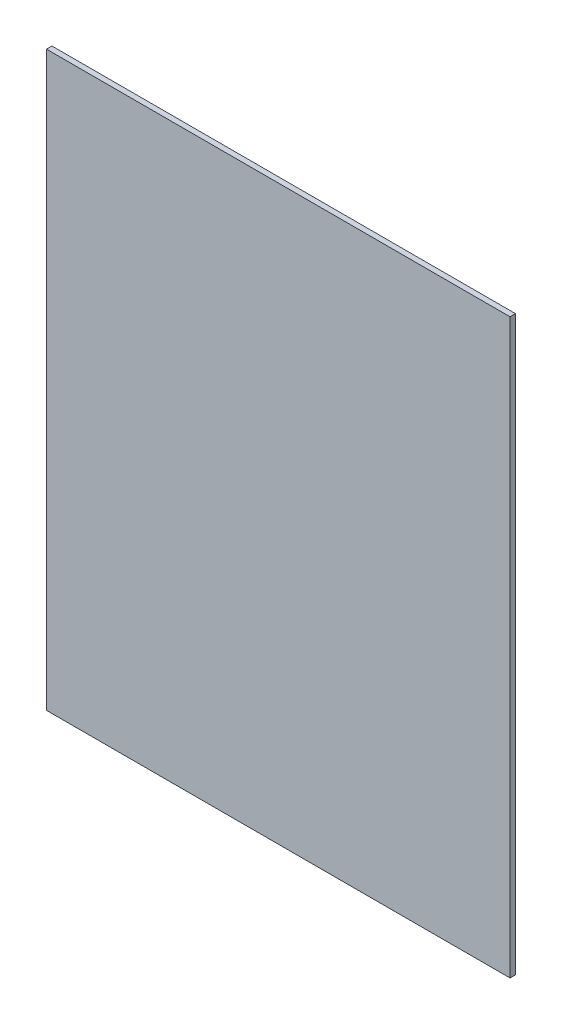
ISO-10303-21;
HEADER;
FILE_DESCRIPTION(('STEP AP214'),'2;1');
FILE_NAME('part.step','',(''),(''),'','','');
FILE_SCHEMA(('AUTOMOTIVE_DESIGN { 1 0 10303 214 1 1 1 1 }'));
ENDSEC;
DATA;
#1=APPLICATION_CONTEXT('core data for automotive mechanical design processes');
#2=APPLICATION_PROTOCOL_DEFINITION('international standard','automotive_design',2000,#1);
#3=PRODUCT_CONTEXT('',#1,'mechanical');
#4=PRODUCT('Part','Part','',(#3));
#5=PRODUCT_RELATED_PRODUCT_CATEGORY('part','',(#4));
#6=PRODUCT_DEFINITION_FORMATION('','',#4);
#7=PRODUCT_DEFINITION_CONTEXT('part definition',#1,'design');
#8=PRODUCT_DEFINITION('design','',#6,#7);
#9=PRODUCT_DEFINITION_SHAPE('','',#8);
#10=(LENGTH_UNIT() NAMED_UNIT(*) SI_UNIT(.MILLI.,.METRE.));
#11=(NAMED_UNIT(*) PLANE_ANGLE_UNIT() SI_UNIT($,.RADIAN.));
#12=(NAMED_UNIT(*) SI_UNIT($,.STERADIAN.) SOLID_ANGLE_UNIT());
#13=UNCERTAINTY_MEASURE_WITH_UNIT(LENGTH_MEASURE(1.E-05),#10,'distance_accuracy_value','');
#14=(GEOMETRIC_REPRESENTATION_CONTEXT(3) GLOBAL_UNCERTAINTY_ASSIGNED_CONTEXT((#13)) GLOBAL_UNIT_ASSIGNED_CONTEXT((#10,
#11,#12)) REPRESENTATION_CONTEXT('',''));
#15=CARTESIAN_POINT('',(0.,0.,0.));
#16=DIRECTION('',(0.,0.,1.));
#17=DIRECTION('',(1.,0.,0.));
#18=AXIS2_PLACEMENT_3D('',#15,#16,#17);
#19=CARTESIAN_POINT('',(-85.,-105.,2.));
#20=DIRECTION('',(1.,0.,0.));
#21=DIRECTION('',(0.,0.,-1.));
#22=AXIS2_PLACEMENT_3D('',#19,#20,#21);
#23=PLANE('',#22);
#24=DIRECTION('',(0.,-1.,0.));
#25=VECTOR('',#24,1.);
#26=CARTESIAN_POINT('',(-85.,-105.,0.));
#27=LINE('',#26,#25);
#28=CARTESIAN_POINT('',(-85.,105.,0.));
#29=VERTEX_POINT('',#28);
#30=CARTESIAN_POINT('',(-85.,-105.,0.));
#31=VERTEX_POINT('',#30);
#32=EDGE_CURVE('E98',#29,#31,#27,.T.);
#33=ORIENTED_EDGE('',*,*,#32,.T.);
#34=DIRECTION('',(0.,0.,-1.));
#35=VECTOR('',#34,1.);
#36=CARTESIAN_POINT('',(-85.,-105.,2.));
#37=LINE('',#36,#35);
#38=CARTESIAN_POINT('',(-85.,-105.,2.));
#39=VERTEX_POINT('',#38);
#40=EDGE_CURVE('E11',#39,#31,#37,.T.);
#41=ORIENTED_EDGE('',*,*,#40,.F.);
#42=DIRECTION('',(0.,-1.,0.));
#43=VECTOR('',#42,1.);
#44=CARTESIAN_POINT('',(-85.,-105.,2.));
#45=LINE('',#44,#43);
#46=CARTESIAN_POINT('',(-85.,105.,2.));
#47=VERTEX_POINT('',#46);
#48=EDGE_CURVE('E86',#47,#39,#45,.T.);
#49=ORIENTED_EDGE('',*,*,#48,.F.);
#50=DIRECTION('',(0.,0.,-1.));
#51=VECTOR('',#50,1.);
#52=CARTESIAN_POINT('',(-85.,105.,2.));
#53=LINE('',#52,#51);
#54=EDGE_CURVE('E94',#47,#29,#53,.T.);
#55=ORIENTED_EDGE('',*,*,#54,.T.);
#56=EDGE_LOOP('',(#33,#41,#49,#55));
#57=FACE_BOUND('',#56,.T.);
#58=ADVANCED_FACE('F35',(#57),#23,.F.);
#59=CARTESIAN_POINT('',(85.,-105.,2.));
#60=DIRECTION('',(0.,1.,0.));
#61=DIRECTION('',(-1.,0.,0.));
#62=AXIS2_PLACEMENT_3D('',#59,#60,#61);
#63=PLANE('',#62);
#64=DIRECTION('',(1.,0.,0.));
#65=VECTOR('',#64,1.);
#66=CARTESIAN_POINT('',(85.,-105.,0.));
#67=LINE('',#66,#65);
#68=CARTESIAN_POINT('',(85.,-105.,0.));
#69=VERTEX_POINT('',#68);
#70=EDGE_CURVE('E90',#31,#69,#67,.T.);
#71=ORIENTED_EDGE('',*,*,#70,.T.);
#72=DIRECTION('',(0.,0.,-1.));
#73=VECTOR('',#72,1.);
#74=CARTESIAN_POINT('',(85.,-105.,2.));
#75=LINE('',#74,#73);
#76=CARTESIAN_POINT('',(85.,-105.,2.));
#77=VERTEX_POINT('',#76);
#78=EDGE_CURVE('E43',#77,#69,#75,.T.);
#79=ORIENTED_EDGE('',*,*,#78,.F.);
#80=DIRECTION('',(1.,0.,0.));
#81=VECTOR('',#80,1.);
#82=CARTESIAN_POINT('',(85.,-105.,2.));
#83=LINE('',#82,#81);
#84=EDGE_CURVE('E81',#39,#77,#83,.T.);
#85=ORIENTED_EDGE('',*,*,#84,.F.);
#86=ORIENTED_EDGE('',*,*,#40,.T.);
#87=EDGE_LOOP('',(#71,#79,#85,#86));
#88=FACE_BOUND('',#87,.T.);
#89=ADVANCED_FACE('F89',(#88),#63,.F.);
#90=CARTESIAN_POINT('',(85.,-105.,2.));
#91=DIRECTION('',(-1.,0.,0.));
#92=DIRECTION('',(0.,0.,1.));
#93=AXIS2_PLACEMENT_3D('',#90,#91,#92);
#94=PLANE('',#93);
#95=DIRECTION('',(0.,1.,0.));
#96=VECTOR('',#95,1.);
#97=CARTESIAN_POINT('',(85.,-105.,0.));
#98=LINE('',#97,#96);
#99=CARTESIAN_POINT('',(85.,105.,0.));
#100=VERTEX_POINT('',#99);
#101=EDGE_CURVE('E68',#69,#100,#98,.T.);
#102=ORIENTED_EDGE('',*,*,#101,.T.);
#103=DIRECTION('',(0.,0.,-1.));
#104=VECTOR('',#103,1.);
#105=CARTESIAN_POINT('',(85.,105.,2.));
#106=LINE('',#105,#104);
#107=CARTESIAN_POINT('',(85.,105.,2.));
#108=VERTEX_POINT('',#107);
#109=EDGE_CURVE('E91',#108,#100,#106,.T.);
#110=ORIENTED_EDGE('',*,*,#109,.F.);
#111=DIRECTION('',(0.,1.,0.));
#112=VECTOR('',#111,1.);
#113=CARTESIAN_POINT('',(85.,-105.,2.));
#114=LINE('',#113,#112);
#115=EDGE_CURVE('E84',#77,#108,#114,.T.);
#116=ORIENTED_EDGE('',*,*,#115,.F.);
#117=ORIENTED_EDGE('',*,*,#78,.T.);
#118=EDGE_LOOP('',(#102,#110,#116,#117));
#119=FACE_BOUND('',#118,.T.);
#120=ADVANCED_FACE('F92',(#119),#94,.F.);
#121=CARTESIAN_POINT('',(85.,105.,2.));
#122=DIRECTION('',(0.,-1.,0.));
#123=DIRECTION('',(1.,0.,0.));
#124=AXIS2_PLACEMENT_3D('',#121,#122,#123);
#125=PLANE('',#124);
#126=DIRECTION('',(-1.,0.,0.));
#127=VECTOR('',#126,1.);
#128=CARTESIAN_POINT('',(85.,105.,0.));
#129=LINE('',#128,#127);
#130=EDGE_CURVE('E74',#100,#29,#129,.T.);
#131=ORIENTED_EDGE('',*,*,#130,.T.);
#132=ORIENTED_EDGE('',*,*,#54,.F.);
#133=DIRECTION('',(-1.,0.,0.));
#134=VECTOR('',#133,1.);
#135=CARTESIAN_POINT('',(85.,105.,2.));
#136=LINE('',#135,#134);
#137=EDGE_CURVE('E51',#108,#47,#136,.T.);
#138=ORIENTED_EDGE('',*,*,#137,.F.);
#139=ORIENTED_EDGE('',*,*,#109,.T.);
#140=EDGE_LOOP('',(#131,#132,#138,#139));
#141=FACE_BOUND('',#140,.T.);
#142=ADVANCED_FACE('F105',(#141),#125,.F.);
#143=CARTESIAN_POINT('',(0.,0.,2.));
#144=DIRECTION('',(0.,0.,1.));
#145=DIRECTION('',(1.,0.,0.));
#146=AXIS2_PLACEMENT_3D('',#143,#144,#145);
#147=PLANE('',#146);
#148=ORIENTED_EDGE('',*,*,#48,.T.);
#149=ORIENTED_EDGE('',*,*,#84,.T.);
#150=ORIENTED_EDGE('',*,*,#115,.T.);
#151=ORIENTED_EDGE('',*,*,#137,.T.);
#152=EDGE_LOOP('',(#148,#149,#150,#151));
#153=FACE_BOUND('',#152,.T.);
#154=ADVANCED_FACE('F82',(#153),#147,.T.);
#155=CARTESIAN_POINT('',(0.,0.,0.));
#156=DIRECTION('',(0.,0.,1.));
#157=DIRECTION('',(1.,0.,0.));
#158=AXIS2_PLACEMENT_3D('',#155,#156,#157);
#159=PLANE('',#158);
#160=ORIENTED_EDGE('',*,*,#32,.F.);
#161=ORIENTED_EDGE('',*,*,#130,.F.);
#162=ORIENTED_EDGE('',*,*,#101,.F.);
#163=ORIENTED_EDGE('',*,*,#70,.F.);
#164=EDGE_LOOP('',(#160,#161,#162,#163));
#165=FACE_BOUND('',#164,.T.);
#166=ADVANCED_FACE('F108',(#165),#159,.F.);
#167=CLOSED_SHELL('',(#58,#89,#120,#142,#154,#166));
#168=MANIFOLD_SOLID_BREP('B2',#167);
#169=ADVANCED_BREP_SHAPE_REPRESENTATION('',(#18,#168),#14);
#170=SHAPE_DEFINITION_REPRESENTATION(#9,#169);
ENDSEC;
END-ISO-10303-21;
